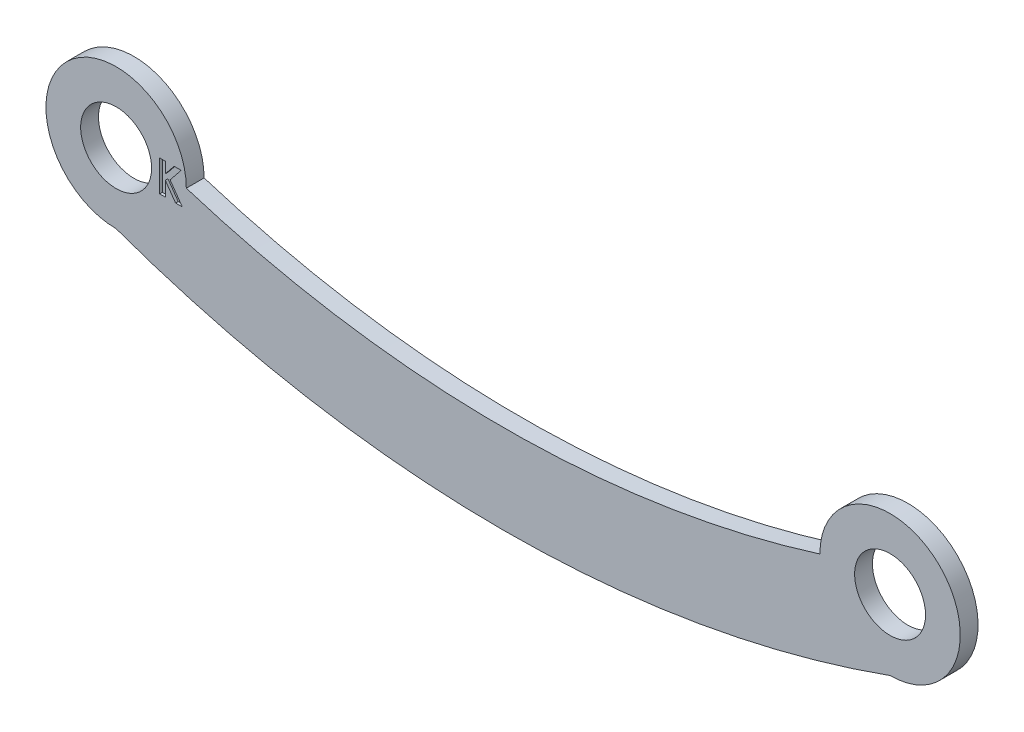
ISO-10303-21;
HEADER;
FILE_DESCRIPTION(('STEP AP214'),'2;1');
FILE_NAME('part.step','',(''),(''),'','','');
FILE_SCHEMA(('AUTOMOTIVE_DESIGN { 1 0 10303 214 1 1 1 1 }'));
ENDSEC;
DATA;
#1=APPLICATION_CONTEXT('core data for automotive mechanical design processes');
#2=APPLICATION_PROTOCOL_DEFINITION('international standard','automotive_design',2000,#1);
#3=PRODUCT_CONTEXT('',#1,'mechanical');
#4=PRODUCT('Part','Part','',(#3));
#5=PRODUCT_RELATED_PRODUCT_CATEGORY('part','',(#4));
#6=PRODUCT_DEFINITION_FORMATION('','',#4);
#7=PRODUCT_DEFINITION_CONTEXT('part definition',#1,'design');
#8=PRODUCT_DEFINITION('design','',#6,#7);
#9=PRODUCT_DEFINITION_SHAPE('','',#8);
#10=(LENGTH_UNIT() NAMED_UNIT(*) SI_UNIT(.MILLI.,.METRE.));
#11=(NAMED_UNIT(*) PLANE_ANGLE_UNIT() SI_UNIT($,.RADIAN.));
#12=(NAMED_UNIT(*) SI_UNIT($,.STERADIAN.) SOLID_ANGLE_UNIT());
#13=UNCERTAINTY_MEASURE_WITH_UNIT(LENGTH_MEASURE(1.E-05),#10,'distance_accuracy_value','');
#14=(GEOMETRIC_REPRESENTATION_CONTEXT(3) GLOBAL_UNCERTAINTY_ASSIGNED_CONTEXT((#13)) GLOBAL_UNIT_ASSIGNED_CONTEXT((#10,
#11,#12)) REPRESENTATION_CONTEXT('',''));
#15=CARTESIAN_POINT('',(0.,0.,0.));
#16=DIRECTION('',(0.,0.,1.));
#17=DIRECTION('',(1.,0.,0.));
#18=AXIS2_PLACEMENT_3D('',#15,#16,#17);
#19=CARTESIAN_POINT('',(0.,0.,2.));
#20=DIRECTION('',(0.,0.,1.));
#21=DIRECTION('',(1.,0.,0.));
#22=AXIS2_PLACEMENT_3D('',#19,#20,#21);
#23=PLANE('',#22);
#24=CARTESIAN_POINT('',(0.,0.,2.));
#25=DIRECTION('',(0.,0.,1.));
#26=DIRECTION('',(1.,0.,0.));
#27=AXIS2_PLACEMENT_3D('',#24,#25,#26);
#28=CIRCLE('',#27,3.985);
#29=CARTESIAN_POINT('',(3.985,0.,2.));
#30=VERTEX_POINT('',#29);
#31=EDGE_CURVE('E187',#30,#30,#28,.T.);
#32=ORIENTED_EDGE('',*,*,#31,.F.);
#33=EDGE_LOOP('',(#32));
#34=FACE_BOUND('',#33,.T.);
#35=CARTESIAN_POINT('',(0.,0.,2.));
#36=DIRECTION('',(0.,0.,1.));
#37=DIRECTION('',(1.,0.,0.));
#38=AXIS2_PLACEMENT_3D('',#35,#36,#37);
#39=CIRCLE('',#38,7.89);
#40=CARTESIAN_POINT('',(0.,-7.89,2.));
#41=VERTEX_POINT('',#40);
#42=CARTESIAN_POINT('',(-7.89,0.,2.));
#43=VERTEX_POINT('',#42);
#44=EDGE_CURVE('E190',#41,#43,#39,.T.);
#45=ORIENTED_EDGE('',*,*,#44,.T.);
#46=CARTESIAN_POINT('',(-43.5,113.002122402205,2.));
#47=DIRECTION('',(0.,0.,1.));
#48=DIRECTION('',(1.,0.,0.));
#49=AXIS2_PLACEMENT_3D('',#46,#47,#48);
#50=CIRCLE('',#49,118.480174575339);
#51=CARTESIAN_POINT('',(-79.11,0.,2.));
#52=VERTEX_POINT('',#51);
#53=EDGE_CURVE('E91',#43,#52,#50,.F.);
#54=ORIENTED_EDGE('',*,*,#53,.T.);
#55=CARTESIAN_POINT('',(-87.,0.,2.));
#56=DIRECTION('',(0.,0.,1.));
#57=DIRECTION('',(1.,0.,0.));
#58=AXIS2_PLACEMENT_3D('',#55,#56,#57);
#59=CIRCLE('',#58,7.89);
#60=CARTESIAN_POINT('',(-87.,-7.89,2.));
#61=VERTEX_POINT('',#60);
#62=EDGE_CURVE('E194',#52,#61,#59,.T.);
#63=ORIENTED_EDGE('',*,*,#62,.T.);
#64=CARTESIAN_POINT('',(-43.5,113.002122402205,2.));
#65=DIRECTION('',(0.,0.,1.));
#66=DIRECTION('',(1.,0.,0.));
#67=AXIS2_PLACEMENT_3D('',#64,#65,#66);
#68=CIRCLE('',#67,128.480174575339);
#69=EDGE_CURVE('E196',#41,#61,#68,.F.);
#70=ORIENTED_EDGE('',*,*,#69,.F.);
#71=EDGE_LOOP('',(#45,#54,#63,#70));
#72=FACE_BOUND('',#71,.T.);
#73=CARTESIAN_POINT('',(-87.,0.,2.));
#74=DIRECTION('',(0.,0.,1.));
#75=DIRECTION('',(1.,0.,0.));
#76=AXIS2_PLACEMENT_3D('',#73,#74,#75);
#77=CIRCLE('',#76,3.98499999999999);
#78=CARTESIAN_POINT('',(-83.015,0.,2.));
#79=VERTEX_POINT('',#78);
#80=EDGE_CURVE('E198',#79,#79,#77,.T.);
#81=ORIENTED_EDGE('',*,*,#80,.F.);
#82=EDGE_LOOP('',(#81));
#83=FACE_BOUND('',#82,.T.);
#84=DIRECTION('',(-1.,0.,0.));
#85=VECTOR('',#84,1.);
#86=CARTESIAN_POINT('',(-81.470495165174,-2.04811509448619,2.));
#87=LINE('',#86,#85);
#88=CARTESIAN_POINT('',(-81.470495165174,-2.04811509448619,2.));
#89=VERTEX_POINT('',#88);
#90=CARTESIAN_POINT('',(-82.0987002933791,-2.04811509448619,2.));
#91=VERTEX_POINT('',#90);
#92=EDGE_CURVE('E172',#89,#91,#87,.T.);
#93=ORIENTED_EDGE('',*,*,#92,.T.);
#94=DIRECTION('',(0.,1.,0.));
#95=VECTOR('',#94,1.);
#96=CARTESIAN_POINT('',(-82.0987002933791,-2.04811509448619,2.));
#97=LINE('',#96,#95);
#98=CARTESIAN_POINT('',(-82.0987002933791,1.45188490551381,2.));
#99=VERTEX_POINT('',#98);
#100=EDGE_CURVE('E56',#91,#99,#97,.T.);
#101=ORIENTED_EDGE('',*,*,#100,.T.);
#102=DIRECTION('',(1.,0.,0.));
#103=VECTOR('',#102,1.);
#104=CARTESIAN_POINT('',(-82.0987002933791,1.45188490551381,2.));
#105=LINE('',#104,#103);
#106=CARTESIAN_POINT('',(-81.470495165174,1.45188490551381,2.));
#107=VERTEX_POINT('',#106);
#108=EDGE_CURVE('E176',#99,#107,#105,.T.);
#109=ORIENTED_EDGE('',*,*,#108,.T.);
#110=DIRECTION('',(0.,-1.,0.));
#111=VECTOR('',#110,1.);
#112=CARTESIAN_POINT('',(-81.470495165174,1.45188490551381,2.));
#113=LINE('',#112,#111);
#114=CARTESIAN_POINT('',(-81.470495165174,0.220013911924066,2.));
#115=VERTEX_POINT('',#114);
#116=EDGE_CURVE('E442',#107,#115,#113,.T.);
#117=ORIENTED_EDGE('',*,*,#116,.T.);
#118=DIRECTION('',(0.62750122533036,0.778615574085759,0.));
#119=VECTOR('',#118,1.);
#120=CARTESIAN_POINT('',(-81.470495165174,0.220013911924066,2.));
#121=LINE('',#120,#119);
#122=CARTESIAN_POINT('',(-80.4777067036355,1.45188490551381,2.));
#123=VERTEX_POINT('',#122);
#124=EDGE_CURVE('E444',#115,#123,#121,.T.);
#125=ORIENTED_EDGE('',*,*,#124,.T.);
#126=DIRECTION('',(1.,0.,0.));
#127=VECTOR('',#126,1.);
#128=CARTESIAN_POINT('',(-80.4777067036355,1.45188490551381,2.));
#129=LINE('',#128,#127);
#130=CARTESIAN_POINT('',(-79.6847379536355,1.45188490551381,2.));
#131=VERTEX_POINT('',#130);
#132=EDGE_CURVE('E448',#123,#131,#129,.T.);
#133=ORIENTED_EDGE('',*,*,#132,.T.);
#134=DIRECTION('',(-0.627400828485831,-0.778696475152734,0.));
#135=VECTOR('',#134,1.);
#136=CARTESIAN_POINT('',(-79.6847379536355,1.45188490551381,2.));
#137=LINE('',#136,#135);
#138=CARTESIAN_POINT('',(-80.9320336267125,-0.0961920175631137,2.));
#139=VERTEX_POINT('',#138);
#140=EDGE_CURVE('E455',#131,#139,#137,.T.);
#141=ORIENTED_EDGE('',*,*,#140,.T.);
#142=DIRECTION('',(0.574093809748458,-0.818789531936322,0.));
#143=VECTOR('',#142,1.);
#144=CARTESIAN_POINT('',(-80.9320336267125,-0.0961920175631137,2.));
#145=LINE('',#144,#143);
#146=CARTESIAN_POINT('',(-79.5634438831227,-2.04811509448619,2.));
#147=VERTEX_POINT('',#146);
#148=EDGE_CURVE('E458',#139,#147,#145,.T.);
#149=ORIENTED_EDGE('',*,*,#148,.T.);
#150=DIRECTION('',(-1.,0.,0.));
#151=VECTOR('',#150,1.);
#152=CARTESIAN_POINT('',(-79.5634438831227,-2.04811509448619,2.));
#153=LINE('',#152,#151);
#154=CARTESIAN_POINT('',(-80.3199542997894,-2.04811509448619,2.));
#155=VERTEX_POINT('',#154);
#156=EDGE_CURVE('E420',#147,#155,#153,.T.);
#157=ORIENTED_EDGE('',*,*,#156,.T.);
#158=DIRECTION('',(-0.574002161068284,0.818853783705577,0.));
#159=VECTOR('',#158,1.);
#160=CARTESIAN_POINT('',(-80.3199542997894,-2.04811509448619,2.));
#161=LINE('',#160,#159);
#162=CARTESIAN_POINT('',(-81.470495165174,-0.406788972691319,2.));
#163=VERTEX_POINT('',#162);
#164=EDGE_CURVE('E417',#155,#163,#161,.T.);
#165=ORIENTED_EDGE('',*,*,#164,.T.);
#166=DIRECTION('',(0.,-1.,0.));
#167=VECTOR('',#166,1.);
#168=CARTESIAN_POINT('',(-81.470495165174,-0.406788972691319,2.));
#169=LINE('',#168,#167);
#170=EDGE_CURVE('E411',#163,#89,#169,.T.);
#171=ORIENTED_EDGE('',*,*,#170,.T.);
#172=EDGE_LOOP('',(#93,#101,#109,#117,#125,#133,#141,#149,#157,#165,#171));
#173=FACE_BOUND('',#172,.T.);
#174=ADVANCED_FACE('F41',(#34,#72,#83,#173),#23,.T.);
#175=CARTESIAN_POINT('',(0.,0.,2.));
#176=DIRECTION('',(0.,0.,-1.));
#177=DIRECTION('',(-1.,0.,0.));
#178=AXIS2_PLACEMENT_3D('',#175,#176,#177);
#179=CYLINDRICAL_SURFACE('',#178,7.89);
#180=CARTESIAN_POINT('',(0.,0.,0.));
#181=DIRECTION('',(0.,0.,1.));
#182=DIRECTION('',(1.,0.,0.));
#183=AXIS2_PLACEMENT_3D('',#180,#181,#182);
#184=CIRCLE('',#183,7.89);
#185=CARTESIAN_POINT('',(0.,-7.89,0.));
#186=VERTEX_POINT('',#185);
#187=CARTESIAN_POINT('',(-7.89,0.,0.));
#188=VERTEX_POINT('',#187);
#189=EDGE_CURVE('E181',#186,#188,#184,.T.);
#190=ORIENTED_EDGE('',*,*,#189,.T.);
#191=DIRECTION('',(0.,0.,-1.));
#192=VECTOR('',#191,1.);
#193=CARTESIAN_POINT('',(-7.89,0.,2.));
#194=LINE('',#193,#192);
#195=EDGE_CURVE('E11',#43,#188,#194,.T.);
#196=ORIENTED_EDGE('',*,*,#195,.F.);
#197=ORIENTED_EDGE('',*,*,#44,.F.);
#198=DIRECTION('',(0.,0.,-1.));
#199=VECTOR('',#198,1.);
#200=CARTESIAN_POINT('',(0.,-7.89,2.));
#201=LINE('',#200,#199);
#202=EDGE_CURVE('E65',#41,#186,#201,.T.);
#203=ORIENTED_EDGE('',*,*,#202,.T.);
#204=EDGE_LOOP('',(#190,#196,#197,#203));
#205=FACE_BOUND('',#204,.T.);
#206=ADVANCED_FACE('F228',(#205),#179,.T.);
#207=CARTESIAN_POINT('',(-43.5,113.002122402205,2.));
#208=DIRECTION('',(0.,0.,-1.));
#209=DIRECTION('',(-1.,0.,0.));
#210=AXIS2_PLACEMENT_3D('',#207,#208,#209);
#211=CYLINDRICAL_SURFACE('',#210,118.480174575339);
#212=CARTESIAN_POINT('',(-43.5,113.002122402205,0.));
#213=DIRECTION('',(0.,0.,1.));
#214=DIRECTION('',(1.,0.,0.));
#215=AXIS2_PLACEMENT_3D('',#212,#213,#214);
#216=CIRCLE('',#215,118.480174575339);
#217=CARTESIAN_POINT('',(-79.11,0.,0.));
#218=VERTEX_POINT('',#217);
#219=EDGE_CURVE('E202',#188,#218,#216,.F.);
#220=ORIENTED_EDGE('',*,*,#219,.T.);
#221=DIRECTION('',(0.,0.,-1.));
#222=VECTOR('',#221,1.);
#223=CARTESIAN_POINT('',(-79.11,0.,2.));
#224=LINE('',#223,#222);
#225=EDGE_CURVE('E49',#52,#218,#224,.T.);
#226=ORIENTED_EDGE('',*,*,#225,.F.);
#227=ORIENTED_EDGE('',*,*,#53,.F.);
#228=ORIENTED_EDGE('',*,*,#195,.T.);
#229=EDGE_LOOP('',(#220,#226,#227,#228));
#230=FACE_BOUND('',#229,.T.);
#231=ADVANCED_FACE('F229',(#230),#211,.F.);
#232=CARTESIAN_POINT('',(-87.,0.,2.));
#233=DIRECTION('',(0.,0.,-1.));
#234=DIRECTION('',(-1.,0.,0.));
#235=AXIS2_PLACEMENT_3D('',#232,#233,#234);
#236=CYLINDRICAL_SURFACE('',#235,7.89);
#237=CARTESIAN_POINT('',(-87.,0.,0.));
#238=DIRECTION('',(0.,0.,1.));
#239=DIRECTION('',(1.,0.,0.));
#240=AXIS2_PLACEMENT_3D('',#237,#238,#239);
#241=CIRCLE('',#240,7.89);
#242=CARTESIAN_POINT('',(-87.,-7.89,0.));
#243=VERTEX_POINT('',#242);
#244=EDGE_CURVE('E204',#218,#243,#241,.T.);
#245=ORIENTED_EDGE('',*,*,#244,.T.);
#246=DIRECTION('',(0.,0.,-1.));
#247=VECTOR('',#246,1.);
#248=CARTESIAN_POINT('',(-87.,-7.89,2.));
#249=LINE('',#248,#247);
#250=EDGE_CURVE('E213',#61,#243,#249,.T.);
#251=ORIENTED_EDGE('',*,*,#250,.F.);
#252=ORIENTED_EDGE('',*,*,#62,.F.);
#253=ORIENTED_EDGE('',*,*,#225,.T.);
#254=EDGE_LOOP('',(#245,#251,#252,#253));
#255=FACE_BOUND('',#254,.T.);
#256=ADVANCED_FACE('F218',(#255),#236,.T.);
#257=CARTESIAN_POINT('',(-43.5,113.002122402205,2.));
#258=DIRECTION('',(0.,0.,-1.));
#259=DIRECTION('',(-1.,0.,0.));
#260=AXIS2_PLACEMENT_3D('',#257,#258,#259);
#261=CYLINDRICAL_SURFACE('',#260,128.480174575339);
#262=CARTESIAN_POINT('',(-43.5,113.002122402205,0.));
#263=DIRECTION('',(0.,0.,1.));
#264=DIRECTION('',(1.,0.,0.));
#265=AXIS2_PLACEMENT_3D('',#262,#263,#264);
#266=CIRCLE('',#265,128.480174575339);
#267=EDGE_CURVE('E207',#186,#243,#266,.F.);
#268=ORIENTED_EDGE('',*,*,#267,.F.);
#269=ORIENTED_EDGE('',*,*,#202,.F.);
#270=ORIENTED_EDGE('',*,*,#69,.T.);
#271=ORIENTED_EDGE('',*,*,#250,.T.);
#272=EDGE_LOOP('',(#268,#269,#270,#271));
#273=FACE_BOUND('',#272,.T.);
#274=ADVANCED_FACE('F223',(#273),#261,.T.);
#275=CARTESIAN_POINT('',(0.,0.,2.));
#276=DIRECTION('',(0.,0.,-1.));
#277=DIRECTION('',(-1.,0.,0.));
#278=AXIS2_PLACEMENT_3D('',#275,#276,#277);
#279=CYLINDRICAL_SURFACE('',#278,3.985);
#280=ORIENTED_EDGE('',*,*,#31,.T.);
#281=EDGE_LOOP('',(#280));
#282=FACE_BOUND('',#281,.T.);
#283=CARTESIAN_POINT('',(0.,0.,0.));
#284=DIRECTION('',(0.,0.,1.));
#285=DIRECTION('',(1.,0.,0.));
#286=AXIS2_PLACEMENT_3D('',#283,#284,#285);
#287=CIRCLE('',#286,3.985);
#288=CARTESIAN_POINT('',(3.985,0.,0.));
#289=VERTEX_POINT('',#288);
#290=EDGE_CURVE('E177',#289,#289,#287,.T.);
#291=ORIENTED_EDGE('',*,*,#290,.F.);
#292=EDGE_LOOP('',(#291));
#293=FACE_BOUND('',#292,.T.);
#294=ADVANCED_FACE('F43',(#282,#293),#279,.F.);
#295=CARTESIAN_POINT('',(-87.,0.,2.));
#296=DIRECTION('',(0.,0.,-1.));
#297=DIRECTION('',(-1.,0.,0.));
#298=AXIS2_PLACEMENT_3D('',#295,#296,#297);
#299=CYLINDRICAL_SURFACE('',#298,3.98499999999999);
#300=ORIENTED_EDGE('',*,*,#80,.T.);
#301=EDGE_LOOP('',(#300));
#302=FACE_BOUND('',#301,.T.);
#303=CARTESIAN_POINT('',(-87.,0.,0.));
#304=DIRECTION('',(0.,0.,1.));
#305=DIRECTION('',(1.,0.,0.));
#306=AXIS2_PLACEMENT_3D('',#303,#304,#305);
#307=CIRCLE('',#306,3.98499999999999);
#308=CARTESIAN_POINT('',(-83.015,0.,0.));
#309=VERTEX_POINT('',#308);
#310=EDGE_CURVE('E191',#309,#309,#307,.T.);
#311=ORIENTED_EDGE('',*,*,#310,.F.);
#312=EDGE_LOOP('',(#311));
#313=FACE_BOUND('',#312,.T.);
#314=ADVANCED_FACE('F249',(#302,#313),#299,.F.);
#315=CARTESIAN_POINT('',(0.,0.,0.));
#316=DIRECTION('',(0.,0.,1.));
#317=DIRECTION('',(1.,0.,0.));
#318=AXIS2_PLACEMENT_3D('',#315,#316,#317);
#319=PLANE('',#318);
#320=ORIENTED_EDGE('',*,*,#290,.T.);
#321=EDGE_LOOP('',(#320));
#322=FACE_BOUND('',#321,.T.);
#323=ORIENTED_EDGE('',*,*,#189,.F.);
#324=ORIENTED_EDGE('',*,*,#267,.T.);
#325=ORIENTED_EDGE('',*,*,#244,.F.);
#326=ORIENTED_EDGE('',*,*,#219,.F.);
#327=EDGE_LOOP('',(#323,#324,#325,#326));
#328=FACE_BOUND('',#327,.T.);
#329=ORIENTED_EDGE('',*,*,#310,.T.);
#330=EDGE_LOOP('',(#329));
#331=FACE_BOUND('',#330,.T.);
#332=ADVANCED_FACE('F221',(#322,#328,#331),#319,.F.);
#333=CARTESIAN_POINT('',(-82.0987002933791,-2.04811509448619,1.7));
#334=DIRECTION('',(1.,0.,0.));
#335=DIRECTION('',(0.,0.,-1.));
#336=AXIS2_PLACEMENT_3D('',#333,#334,#335);
#337=PLANE('',#336);
#338=ORIENTED_EDGE('',*,*,#100,.F.);
#339=DIRECTION('',(0.,0.,1.));
#340=VECTOR('',#339,1.);
#341=CARTESIAN_POINT('',(-82.0987002933791,-2.04811509448619,1.7));
#342=LINE('',#341,#340);
#343=CARTESIAN_POINT('',(-82.0987002933791,-2.04811509448619,1.7));
#344=VERTEX_POINT('',#343);
#345=EDGE_CURVE('E171',#344,#91,#342,.T.);
#346=ORIENTED_EDGE('',*,*,#345,.F.);
#347=DIRECTION('',(0.,1.,0.));
#348=VECTOR('',#347,1.);
#349=CARTESIAN_POINT('',(-82.0987002933791,-2.04811509448619,1.7));
#350=LINE('',#349,#348);
#351=CARTESIAN_POINT('',(-82.0987002933791,1.45188490551381,1.7));
#352=VERTEX_POINT('',#351);
#353=EDGE_CURVE('E162',#344,#352,#350,.T.);
#354=ORIENTED_EDGE('',*,*,#353,.T.);
#355=DIRECTION('',(0.,0.,1.));
#356=VECTOR('',#355,1.);
#357=CARTESIAN_POINT('',(-82.0987002933791,1.45188490551381,1.7));
#358=LINE('',#357,#356);
#359=EDGE_CURVE('E170',#352,#99,#358,.T.);
#360=ORIENTED_EDGE('',*,*,#359,.T.);
#361=EDGE_LOOP('',(#338,#346,#354,#360));
#362=FACE_BOUND('',#361,.T.);
#363=ADVANCED_FACE('F169',(#362),#337,.T.);
#364=CARTESIAN_POINT('',(-82.0987002933791,1.45188490551381,1.7));
#365=DIRECTION('',(0.,-1.,0.));
#366=DIRECTION('',(0.,0.,-1.));
#367=AXIS2_PLACEMENT_3D('',#364,#365,#366);
#368=PLANE('',#367);
#369=ORIENTED_EDGE('',*,*,#108,.F.);
#370=ORIENTED_EDGE('',*,*,#359,.F.);
#371=DIRECTION('',(1.,0.,0.));
#372=VECTOR('',#371,1.);
#373=CARTESIAN_POINT('',(-82.0987002933791,1.45188490551381,1.7));
#374=LINE('',#373,#372);
#375=CARTESIAN_POINT('',(-81.470495165174,1.45188490551381,1.7));
#376=VERTEX_POINT('',#375);
#377=EDGE_CURVE('E158',#352,#376,#374,.T.);
#378=ORIENTED_EDGE('',*,*,#377,.T.);
#379=DIRECTION('',(0.,0.,1.));
#380=VECTOR('',#379,1.);
#381=CARTESIAN_POINT('',(-81.470495165174,1.45188490551381,1.7));
#382=LINE('',#381,#380);
#383=EDGE_CURVE('E178',#376,#107,#382,.T.);
#384=ORIENTED_EDGE('',*,*,#383,.T.);
#385=EDGE_LOOP('',(#369,#370,#378,#384));
#386=FACE_BOUND('',#385,.T.);
#387=ADVANCED_FACE('F174',(#386),#368,.T.);
#388=CARTESIAN_POINT('',(-81.470495165174,1.45188490551381,1.7));
#389=DIRECTION('',(-1.,0.,0.));
#390=DIRECTION('',(0.,0.,1.));
#391=AXIS2_PLACEMENT_3D('',#388,#389,#390);
#392=PLANE('',#391);
#393=ORIENTED_EDGE('',*,*,#116,.F.);
#394=ORIENTED_EDGE('',*,*,#383,.F.);
#395=DIRECTION('',(0.,-1.,0.));
#396=VECTOR('',#395,1.);
#397=CARTESIAN_POINT('',(-81.470495165174,1.45188490551381,1.7));
#398=LINE('',#397,#396);
#399=CARTESIAN_POINT('',(-81.470495165174,0.220013911924066,1.7));
#400=VERTEX_POINT('',#399);
#401=EDGE_CURVE('E164',#376,#400,#398,.T.);
#402=ORIENTED_EDGE('',*,*,#401,.T.);
#403=DIRECTION('',(0.,0.,1.));
#404=VECTOR('',#403,1.);
#405=CARTESIAN_POINT('',(-81.470495165174,0.220013911924066,1.7));
#406=LINE('',#405,#404);
#407=EDGE_CURVE('E183',#400,#115,#406,.T.);
#408=ORIENTED_EDGE('',*,*,#407,.T.);
#409=EDGE_LOOP('',(#393,#394,#402,#408));
#410=FACE_BOUND('',#409,.T.);
#411=ADVANCED_FACE('F306',(#410),#392,.T.);
#412=CARTESIAN_POINT('',(-81.470495165174,0.220013911924066,1.7));
#413=DIRECTION('',(0.778615574085759,-0.62750122533036,0.));
#414=DIRECTION('',(0.62750122533036,0.778615574085759,0.));
#415=AXIS2_PLACEMENT_3D('',#412,#413,#414);
#416=PLANE('',#415);
#417=ORIENTED_EDGE('',*,*,#124,.F.);
#418=ORIENTED_EDGE('',*,*,#407,.F.);
#419=DIRECTION('',(0.62750122533036,0.778615574085759,0.));
#420=VECTOR('',#419,1.);
#421=CARTESIAN_POINT('',(-81.470495165174,0.220013911924066,1.7));
#422=LINE('',#421,#420);
#423=CARTESIAN_POINT('',(-80.4777067036355,1.45188490551381,1.7));
#424=VERTEX_POINT('',#423);
#425=EDGE_CURVE('E481',#400,#424,#422,.T.);
#426=ORIENTED_EDGE('',*,*,#425,.T.);
#427=DIRECTION('',(0.,0.,1.));
#428=VECTOR('',#427,1.);
#429=CARTESIAN_POINT('',(-80.4777067036355,1.45188490551381,1.7));
#430=LINE('',#429,#428);
#431=EDGE_CURVE('E437',#424,#123,#430,.T.);
#432=ORIENTED_EDGE('',*,*,#431,.T.);
#433=EDGE_LOOP('',(#417,#418,#426,#432));
#434=FACE_BOUND('',#433,.T.);
#435=ADVANCED_FACE('F314',(#434),#416,.T.);
#436=CARTESIAN_POINT('',(-80.4777067036355,1.45188490551381,1.7));
#437=DIRECTION('',(0.,-1.,0.));
#438=DIRECTION('',(0.,0.,-1.));
#439=AXIS2_PLACEMENT_3D('',#436,#437,#438);
#440=PLANE('',#439);
#441=ORIENTED_EDGE('',*,*,#132,.F.);
#442=ORIENTED_EDGE('',*,*,#431,.F.);
#443=DIRECTION('',(1.,0.,0.));
#444=VECTOR('',#443,1.);
#445=CARTESIAN_POINT('',(-80.4777067036355,1.45188490551381,1.7));
#446=LINE('',#445,#444);
#447=CARTESIAN_POINT('',(-79.6847379536355,1.45188490551381,1.7));
#448=VERTEX_POINT('',#447);
#449=EDGE_CURVE('E479',#424,#448,#446,.T.);
#450=ORIENTED_EDGE('',*,*,#449,.T.);
#451=DIRECTION('',(0.,0.,1.));
#452=VECTOR('',#451,1.);
#453=CARTESIAN_POINT('',(-79.6847379536355,1.45188490551381,1.7));
#454=LINE('',#453,#452);
#455=EDGE_CURVE('E435',#448,#131,#454,.T.);
#456=ORIENTED_EDGE('',*,*,#455,.T.);
#457=EDGE_LOOP('',(#441,#442,#450,#456));
#458=FACE_BOUND('',#457,.T.);
#459=ADVANCED_FACE('F324',(#458),#440,.T.);
#460=CARTESIAN_POINT('',(-79.6847379536355,1.45188490551381,1.7));
#461=DIRECTION('',(-0.778696475152734,0.627400828485831,0.));
#462=DIRECTION('',(-0.627400828485831,-0.778696475152734,0.));
#463=AXIS2_PLACEMENT_3D('',#460,#461,#462);
#464=PLANE('',#463);
#465=ORIENTED_EDGE('',*,*,#140,.F.);
#466=ORIENTED_EDGE('',*,*,#455,.F.);
#467=DIRECTION('',(-0.627400828485831,-0.778696475152734,0.));
#468=VECTOR('',#467,1.);
#469=CARTESIAN_POINT('',(-79.6847379536355,1.45188490551381,1.7));
#470=LINE('',#469,#468);
#471=CARTESIAN_POINT('',(-80.9320336267125,-0.0961920175631137,1.7));
#472=VERTEX_POINT('',#471);
#473=EDGE_CURVE('E477',#448,#472,#470,.T.);
#474=ORIENTED_EDGE('',*,*,#473,.T.);
#475=DIRECTION('',(0.,0.,1.));
#476=VECTOR('',#475,1.);
#477=CARTESIAN_POINT('',(-80.9320336267125,-0.0961920175631137,1.7));
#478=LINE('',#477,#476);
#479=EDGE_CURVE('E433',#472,#139,#478,.T.);
#480=ORIENTED_EDGE('',*,*,#479,.T.);
#481=EDGE_LOOP('',(#465,#466,#474,#480));
#482=FACE_BOUND('',#481,.T.);
#483=ADVANCED_FACE('F334',(#482),#464,.T.);
#484=CARTESIAN_POINT('',(-80.9320336267125,-0.0961920175631137,1.7));
#485=DIRECTION('',(-0.818789531936322,-0.574093809748458,0.));
#486=DIRECTION('',(0.574093809748458,-0.818789531936322,0.));
#487=AXIS2_PLACEMENT_3D('',#484,#485,#486);
#488=PLANE('',#487);
#489=ORIENTED_EDGE('',*,*,#148,.F.);
#490=ORIENTED_EDGE('',*,*,#479,.F.);
#491=DIRECTION('',(0.574093809748458,-0.818789531936322,0.));
#492=VECTOR('',#491,1.);
#493=CARTESIAN_POINT('',(-80.9320336267125,-0.0961920175631137,1.7));
#494=LINE('',#493,#492);
#495=CARTESIAN_POINT('',(-79.5634438831227,-2.04811509448619,1.7));
#496=VERTEX_POINT('',#495);
#497=EDGE_CURVE('E475',#472,#496,#494,.T.);
#498=ORIENTED_EDGE('',*,*,#497,.T.);
#499=DIRECTION('',(0.,0.,1.));
#500=VECTOR('',#499,1.);
#501=CARTESIAN_POINT('',(-79.5634438831227,-2.04811509448619,1.7));
#502=LINE('',#501,#500);
#503=EDGE_CURVE('E431',#496,#147,#502,.T.);
#504=ORIENTED_EDGE('',*,*,#503,.T.);
#505=EDGE_LOOP('',(#489,#490,#498,#504));
#506=FACE_BOUND('',#505,.T.);
#507=ADVANCED_FACE('F344',(#506),#488,.T.);
#508=CARTESIAN_POINT('',(-79.5634438831227,-2.04811509448619,1.7));
#509=DIRECTION('',(0.,1.,0.));
#510=DIRECTION('',(0.,0.,1.));
#511=AXIS2_PLACEMENT_3D('',#508,#509,#510);
#512=PLANE('',#511);
#513=ORIENTED_EDGE('',*,*,#156,.F.);
#514=ORIENTED_EDGE('',*,*,#503,.F.);
#515=DIRECTION('',(-1.,0.,0.));
#516=VECTOR('',#515,1.);
#517=CARTESIAN_POINT('',(-79.5634438831227,-2.04811509448619,1.7));
#518=LINE('',#517,#516);
#519=CARTESIAN_POINT('',(-80.3199542997894,-2.04811509448619,1.7));
#520=VERTEX_POINT('',#519);
#521=EDGE_CURVE('E465',#496,#520,#518,.T.);
#522=ORIENTED_EDGE('',*,*,#521,.T.);
#523=DIRECTION('',(0.,0.,1.));
#524=VECTOR('',#523,1.);
#525=CARTESIAN_POINT('',(-80.3199542997894,-2.04811509448619,1.7));
#526=LINE('',#525,#524);
#527=EDGE_CURVE('E429',#520,#155,#526,.T.);
#528=ORIENTED_EDGE('',*,*,#527,.T.);
#529=EDGE_LOOP('',(#513,#514,#522,#528));
#530=FACE_BOUND('',#529,.T.);
#531=ADVANCED_FACE('F354',(#530),#512,.T.);
#532=CARTESIAN_POINT('',(-80.3199542997894,-2.04811509448619,1.7));
#533=DIRECTION('',(0.818853783705577,0.574002161068284,0.));
#534=DIRECTION('',(-0.574002161068284,0.818853783705577,0.));
#535=AXIS2_PLACEMENT_3D('',#532,#533,#534);
#536=PLANE('',#535);
#537=ORIENTED_EDGE('',*,*,#164,.F.);
#538=ORIENTED_EDGE('',*,*,#527,.F.);
#539=DIRECTION('',(-0.574002161068284,0.818853783705577,0.));
#540=VECTOR('',#539,1.);
#541=CARTESIAN_POINT('',(-80.3199542997894,-2.04811509448619,1.7));
#542=LINE('',#541,#540);
#543=CARTESIAN_POINT('',(-81.470495165174,-0.406788972691319,1.7));
#544=VERTEX_POINT('',#543);
#545=EDGE_CURVE('E467',#520,#544,#542,.T.);
#546=ORIENTED_EDGE('',*,*,#545,.T.);
#547=DIRECTION('',(0.,0.,1.));
#548=VECTOR('',#547,1.);
#549=CARTESIAN_POINT('',(-81.470495165174,-0.406788972691319,1.7));
#550=LINE('',#549,#548);
#551=EDGE_CURVE('E427',#544,#163,#550,.T.);
#552=ORIENTED_EDGE('',*,*,#551,.T.);
#553=EDGE_LOOP('',(#537,#538,#546,#552));
#554=FACE_BOUND('',#553,.T.);
#555=ADVANCED_FACE('F364',(#554),#536,.T.);
#556=CARTESIAN_POINT('',(-81.470495165174,-0.406788972691319,1.7));
#557=DIRECTION('',(-1.,0.,0.));
#558=DIRECTION('',(0.,0.,1.));
#559=AXIS2_PLACEMENT_3D('',#556,#557,#558);
#560=PLANE('',#559);
#561=ORIENTED_EDGE('',*,*,#170,.F.);
#562=ORIENTED_EDGE('',*,*,#551,.F.);
#563=DIRECTION('',(0.,-1.,0.));
#564=VECTOR('',#563,1.);
#565=CARTESIAN_POINT('',(-81.470495165174,-0.406788972691319,1.7));
#566=LINE('',#565,#564);
#567=CARTESIAN_POINT('',(-81.470495165174,-2.04811509448619,1.7));
#568=VERTEX_POINT('',#567);
#569=EDGE_CURVE('E469',#544,#568,#566,.T.);
#570=ORIENTED_EDGE('',*,*,#569,.T.);
#571=DIRECTION('',(0.,0.,1.));
#572=VECTOR('',#571,1.);
#573=CARTESIAN_POINT('',(-81.470495165174,-2.04811509448619,1.7));
#574=LINE('',#573,#572);
#575=EDGE_CURVE('E409',#568,#89,#574,.T.);
#576=ORIENTED_EDGE('',*,*,#575,.T.);
#577=EDGE_LOOP('',(#561,#562,#570,#576));
#578=FACE_BOUND('',#577,.T.);
#579=ADVANCED_FACE('F374',(#578),#560,.T.);
#580=CARTESIAN_POINT('',(-81.470495165174,-2.04811509448619,1.7));
#581=DIRECTION('',(0.,1.,0.));
#582=DIRECTION('',(0.,0.,1.));
#583=AXIS2_PLACEMENT_3D('',#580,#581,#582);
#584=PLANE('',#583);
#585=ORIENTED_EDGE('',*,*,#92,.F.);
#586=ORIENTED_EDGE('',*,*,#575,.F.);
#587=DIRECTION('',(-1.,0.,0.));
#588=VECTOR('',#587,1.);
#589=CARTESIAN_POINT('',(-81.470495165174,-2.04811509448619,1.7));
#590=LINE('',#589,#588);
#591=EDGE_CURVE('E425',#568,#344,#590,.T.);
#592=ORIENTED_EDGE('',*,*,#591,.T.);
#593=ORIENTED_EDGE('',*,*,#345,.T.);
#594=EDGE_LOOP('',(#585,#586,#592,#593));
#595=FACE_BOUND('',#594,.T.);
#596=ADVANCED_FACE('F384',(#595),#584,.T.);
#597=CARTESIAN_POINT('',(0.,0.,1.7));
#598=DIRECTION('',(0.,0.,-1.));
#599=DIRECTION('',(-1.,0.,0.));
#600=AXIS2_PLACEMENT_3D('',#597,#598,#599);
#601=PLANE('',#600);
#602=ORIENTED_EDGE('',*,*,#353,.F.);
#603=ORIENTED_EDGE('',*,*,#591,.F.);
#604=ORIENTED_EDGE('',*,*,#569,.F.);
#605=ORIENTED_EDGE('',*,*,#545,.F.);
#606=ORIENTED_EDGE('',*,*,#521,.F.);
#607=ORIENTED_EDGE('',*,*,#497,.F.);
#608=ORIENTED_EDGE('',*,*,#473,.F.);
#609=ORIENTED_EDGE('',*,*,#449,.F.);
#610=ORIENTED_EDGE('',*,*,#425,.F.);
#611=ORIENTED_EDGE('',*,*,#401,.F.);
#612=ORIENTED_EDGE('',*,*,#377,.F.);
#613=EDGE_LOOP('',(#602,#603,#604,#605,#606,#607,#608,#609,#610,#611,#612));
#614=FACE_BOUND('',#613,.T.);
#615=ADVANCED_FACE('F160',(#614),#601,.F.);
#616=CLOSED_SHELL('',(#174,#206,#231,#256,#274,#294,#314,#332,#363,#387,#411,#435,#459,#483,
#507,#531,#555,#579,#596,#615));
#617=MANIFOLD_SOLID_BREP('B2',#616);
#618=ADVANCED_BREP_SHAPE_REPRESENTATION('',(#18,#617),#14);
#619=SHAPE_DEFINITION_REPRESENTATION(#9,#618);
ENDSEC;
END-ISO-10303-21;
